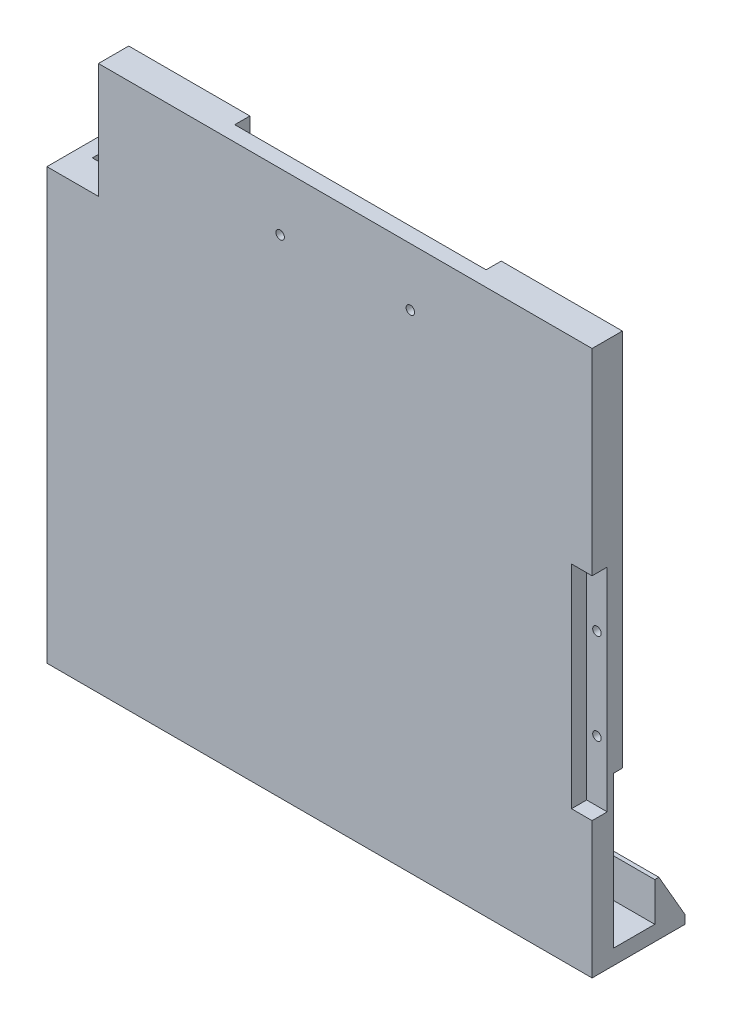
ISO-10303-21;
HEADER;
FILE_DESCRIPTION(('STEP AP214'),'2;1');
FILE_NAME('part.step','',(''),(''),'','','');
FILE_SCHEMA(('AUTOMOTIVE_DESIGN { 1 0 10303 214 1 1 1 1 }'));
ENDSEC;
DATA;
#1=APPLICATION_CONTEXT('core data for automotive mechanical design processes');
#2=APPLICATION_PROTOCOL_DEFINITION('international standard','automotive_design',2000,#1);
#3=PRODUCT_CONTEXT('',#1,'mechanical');
#4=PRODUCT('Part','Part','',(#3));
#5=PRODUCT_RELATED_PRODUCT_CATEGORY('part','',(#4));
#6=PRODUCT_DEFINITION_FORMATION('','',#4);
#7=PRODUCT_DEFINITION_CONTEXT('part definition',#1,'design');
#8=PRODUCT_DEFINITION('design','',#6,#7);
#9=PRODUCT_DEFINITION_SHAPE('','',#8);
#10=(LENGTH_UNIT() NAMED_UNIT(*) SI_UNIT(.MILLI.,.METRE.));
#11=(NAMED_UNIT(*) PLANE_ANGLE_UNIT() SI_UNIT($,.RADIAN.));
#12=(NAMED_UNIT(*) SI_UNIT($,.STERADIAN.) SOLID_ANGLE_UNIT());
#13=UNCERTAINTY_MEASURE_WITH_UNIT(LENGTH_MEASURE(1.E-05),#10,'distance_accuracy_value','');
#14=(GEOMETRIC_REPRESENTATION_CONTEXT(3) GLOBAL_UNCERTAINTY_ASSIGNED_CONTEXT((#13)) GLOBAL_UNIT_ASSIGNED_CONTEXT((#10,
#11,#12)) REPRESENTATION_CONTEXT('',''));
#15=CARTESIAN_POINT('',(0.,0.,0.));
#16=DIRECTION('',(0.,0.,1.));
#17=DIRECTION('',(1.,0.,0.));
#18=AXIS2_PLACEMENT_3D('',#15,#16,#17);
#19=CARTESIAN_POINT('',(0.,180.,30.7));
#20=DIRECTION('',(0.,-1.,0.));
#21=DIRECTION('',(0.,0.,-1.));
#22=AXIS2_PLACEMENT_3D('',#19,#20,#21);
#23=PLANE('',#22);
#24=DIRECTION('',(1.,0.,0.));
#25=VECTOR('',#24,1.);
#26=CARTESIAN_POINT('',(180.,180.,20.7));
#27=LINE('',#26,#25);
#28=CARTESIAN_POINT('',(140.,180.,20.7));
#29=VERTEX_POINT('',#28);
#30=CARTESIAN_POINT('',(180.,180.,20.7));
#31=VERTEX_POINT('',#30);
#32=EDGE_CURVE('E336',#29,#31,#27,.T.);
#33=ORIENTED_EDGE('',*,*,#32,.F.);
#34=DIRECTION('',(0.,0.,-1.));
#35=VECTOR('',#34,1.);
#36=CARTESIAN_POINT('',(140.,180.,25.7));
#37=LINE('',#36,#35);
#38=CARTESIAN_POINT('',(140.,180.,25.7));
#39=VERTEX_POINT('',#38);
#40=EDGE_CURVE('E286',#39,#29,#37,.T.);
#41=ORIENTED_EDGE('',*,*,#40,.F.);
#42=DIRECTION('',(1.,0.,0.));
#43=VECTOR('',#42,1.);
#44=CARTESIAN_POINT('',(140.,180.,25.7));
#45=LINE('',#44,#43);
#46=CARTESIAN_POINT('',(57.01,180.,25.7));
#47=VERTEX_POINT('',#46);
#48=EDGE_CURVE('E277',#47,#39,#45,.T.);
#49=ORIENTED_EDGE('',*,*,#48,.F.);
#50=DIRECTION('',(0.,0.,-1.));
#51=VECTOR('',#50,1.);
#52=CARTESIAN_POINT('',(57.01,180.,25.7));
#53=LINE('',#52,#51);
#54=CARTESIAN_POINT('',(57.01,180.,20.7));
#55=VERTEX_POINT('',#54);
#56=EDGE_CURVE('E289',#47,#55,#53,.T.);
#57=ORIENTED_EDGE('',*,*,#56,.T.);
#58=CARTESIAN_POINT('',(17.01,180.,20.7));
#59=VERTEX_POINT('',#58);
#60=EDGE_CURVE('E337',#59,#55,#27,.T.);
#61=ORIENTED_EDGE('',*,*,#60,.F.);
#62=DIRECTION('',(0.,0.,1.));
#63=VECTOR('',#62,1.);
#64=CARTESIAN_POINT('',(17.01,180.,0.));
#65=LINE('',#64,#63);
#66=CARTESIAN_POINT('',(17.01,180.,30.7));
#67=VERTEX_POINT('',#66);
#68=EDGE_CURVE('E299',#59,#67,#65,.T.);
#69=ORIENTED_EDGE('',*,*,#68,.T.);
#70=DIRECTION('',(-1.,0.,0.));
#71=VECTOR('',#70,1.);
#72=CARTESIAN_POINT('',(0.,180.,30.7));
#73=LINE('',#72,#71);
#74=CARTESIAN_POINT('',(180.,180.,30.7));
#75=VERTEX_POINT('',#74);
#76=EDGE_CURVE('E355',#75,#67,#73,.T.);
#77=ORIENTED_EDGE('',*,*,#76,.F.);
#78=DIRECTION('',(0.,0.,-1.));
#79=VECTOR('',#78,1.);
#80=CARTESIAN_POINT('',(180.,180.,30.7));
#81=LINE('',#80,#79);
#82=EDGE_CURVE('E358',#75,#31,#81,.T.);
#83=ORIENTED_EDGE('',*,*,#82,.T.);
#84=EDGE_LOOP('',(#33,#41,#49,#57,#61,#69,#77,#83));
#85=FACE_BOUND('',#84,.T.);
#86=ADVANCED_FACE('F41',(#85),#23,.F.);
#87=CARTESIAN_POINT('',(0.,0.,30.7));
#88=DIRECTION('',(1.,0.,0.));
#89=DIRECTION('',(0.,0.,-1.));
#90=AXIS2_PLACEMENT_3D('',#87,#88,#89);
#91=PLANE('',#90);
#92=DIRECTION('',(0.,-1.,0.));
#93=VECTOR('',#92,1.);
#94=CARTESIAN_POINT('',(0.,0.,30.7));
#95=LINE('',#94,#93);
#96=CARTESIAN_POINT('',(0.,142.,30.7));
#97=VERTEX_POINT('',#96);
#98=CARTESIAN_POINT('',(0.,0.,30.7));
#99=VERTEX_POINT('',#98);
#100=EDGE_CURVE('E346',#97,#99,#95,.T.);
#101=ORIENTED_EDGE('',*,*,#100,.F.);
#102=DIRECTION('',(0.,0.,1.));
#103=VECTOR('',#102,1.);
#104=CARTESIAN_POINT('',(0.,142.,0.));
#105=LINE('',#104,#103);
#106=CARTESIAN_POINT('',(0.,142.,0.));
#107=VERTEX_POINT('',#106);
#108=EDGE_CURVE('E288',#107,#97,#105,.T.);
#109=ORIENTED_EDGE('',*,*,#108,.F.);
#110=DIRECTION('',(0.,-1.,0.));
#111=VECTOR('',#110,1.);
#112=CARTESIAN_POINT('',(0.,0.,0.));
#113=LINE('',#112,#111);
#114=CARTESIAN_POINT('',(0.,0.,0.));
#115=VERTEX_POINT('',#114);
#116=EDGE_CURVE('E344',#107,#115,#113,.T.);
#117=ORIENTED_EDGE('',*,*,#116,.T.);
#118=DIRECTION('',(0.,0.,-1.));
#119=VECTOR('',#118,1.);
#120=CARTESIAN_POINT('',(0.,0.,30.7));
#121=LINE('',#120,#119);
#122=EDGE_CURVE('E368',#99,#115,#121,.T.);
#123=ORIENTED_EDGE('',*,*,#122,.F.);
#124=EDGE_LOOP('',(#101,#109,#117,#123));
#125=FACE_BOUND('',#124,.T.);
#126=ADVANCED_FACE('F421',(#125),#91,.F.);
#127=CARTESIAN_POINT('',(0.,0.,30.7));
#128=DIRECTION('',(0.,1.,0.));
#129=DIRECTION('',(0.,0.,1.));
#130=AXIS2_PLACEMENT_3D('',#127,#128,#129);
#131=PLANE('',#130);
#132=DIRECTION('',(1.,0.,0.));
#133=VECTOR('',#132,1.);
#134=CARTESIAN_POINT('',(0.,0.,0.));
#135=LINE('',#134,#133);
#136=CARTESIAN_POINT('',(180.,0.,0.));
#137=VERTEX_POINT('',#136);
#138=EDGE_CURVE('E360',#115,#137,#135,.T.);
#139=ORIENTED_EDGE('',*,*,#138,.T.);
#140=DIRECTION('',(0.,0.,-1.));
#141=VECTOR('',#140,1.);
#142=CARTESIAN_POINT('',(180.,0.,30.7));
#143=LINE('',#142,#141);
#144=CARTESIAN_POINT('',(180.,0.,30.7));
#145=VERTEX_POINT('',#144);
#146=EDGE_CURVE('E365',#145,#137,#143,.T.);
#147=ORIENTED_EDGE('',*,*,#146,.F.);
#148=DIRECTION('',(1.,0.,0.));
#149=VECTOR('',#148,1.);
#150=CARTESIAN_POINT('',(0.,0.,30.7));
#151=LINE('',#150,#149);
#152=EDGE_CURVE('E348',#99,#145,#151,.T.);
#153=ORIENTED_EDGE('',*,*,#152,.F.);
#154=ORIENTED_EDGE('',*,*,#122,.T.);
#155=EDGE_LOOP('',(#139,#147,#153,#154));
#156=FACE_BOUND('',#155,.T.);
#157=ADVANCED_FACE('F429',(#156),#131,.F.);
#158=CARTESIAN_POINT('',(180.,0.,30.7));
#159=DIRECTION('',(-1.,0.,0.));
#160=DIRECTION('',(0.,0.,1.));
#161=AXIS2_PLACEMENT_3D('',#158,#159,#160);
#162=PLANE('',#161);
#163=DIRECTION('',(0.,1.,0.));
#164=VECTOR('',#163,1.);
#165=CARTESIAN_POINT('',(180.,0.,0.));
#166=LINE('',#165,#164);
#167=CARTESIAN_POINT('',(180.,2.7899999999999,0.));
#168=VERTEX_POINT('',#167);
#169=EDGE_CURVE('E349',#137,#168,#166,.T.);
#170=ORIENTED_EDGE('',*,*,#169,.T.);
#171=DIRECTION('',(0.,0.86602540378444,0.499999999999997));
#172=VECTOR('',#171,1.);
#173=CARTESIAN_POINT('',(180.,17.79,8.66025403784437));
#174=LINE('',#173,#172);
#175=CARTESIAN_POINT('',(180.,17.79,8.66025403784437));
#176=VERTEX_POINT('',#175);
#177=EDGE_CURVE('E12',#168,#176,#174,.T.);
#178=ORIENTED_EDGE('',*,*,#177,.T.);
#179=DIRECTION('',(0.,0.,-1.));
#180=VECTOR('',#179,1.);
#181=CARTESIAN_POINT('',(180.,17.79,20.7));
#182=LINE('',#181,#180);
#183=CARTESIAN_POINT('',(180.,17.79,10.));
#184=VERTEX_POINT('',#183);
#185=EDGE_CURVE('E340',#184,#176,#182,.T.);
#186=ORIENTED_EDGE('',*,*,#185,.F.);
#187=DIRECTION('',(0.,1.,0.));
#188=VECTOR('',#187,1.);
#189=CARTESIAN_POINT('',(180.,-175.326809130834,10.));
#190=LINE('',#189,#188);
#191=CARTESIAN_POINT('',(180.,5.,10.));
#192=VERTEX_POINT('',#191);
#193=EDGE_CURVE('E320',#192,#184,#190,.T.);
#194=ORIENTED_EDGE('',*,*,#193,.F.);
#195=DIRECTION('',(0.,0.,1.));
#196=VECTOR('',#195,1.);
#197=CARTESIAN_POINT('',(180.,5.,20.7));
#198=LINE('',#197,#196);
#199=CARTESIAN_POINT('',(180.,5.,23.7));
#200=VERTEX_POINT('',#199);
#201=EDGE_CURVE('E323',#192,#200,#198,.T.);
#202=ORIENTED_EDGE('',*,*,#201,.T.);
#203=DIRECTION('',(0.,-1.,0.));
#204=VECTOR('',#203,1.);
#205=CARTESIAN_POINT('',(180.,5.,23.7));
#206=LINE('',#205,#204);
#207=CARTESIAN_POINT('',(180.,55.,23.7));
#208=VERTEX_POINT('',#207);
#209=EDGE_CURVE('E223',#208,#200,#206,.T.);
#210=ORIENTED_EDGE('',*,*,#209,.F.);
#211=DIRECTION('',(0.,0.,-1.));
#212=VECTOR('',#211,1.);
#213=CARTESIAN_POINT('',(180.,55.,23.7));
#214=LINE('',#213,#212);
#215=CARTESIAN_POINT('',(180.,55.,20.7));
#216=VERTEX_POINT('',#215);
#217=EDGE_CURVE('E213',#208,#216,#214,.T.);
#218=ORIENTED_EDGE('',*,*,#217,.T.);
#219=DIRECTION('',(0.,-1.,0.));
#220=VECTOR('',#219,1.);
#221=CARTESIAN_POINT('',(180.,17.79,20.7));
#222=LINE('',#221,#220);
#223=EDGE_CURVE('E333',#31,#216,#222,.T.);
#224=ORIENTED_EDGE('',*,*,#223,.F.);
#225=ORIENTED_EDGE('',*,*,#82,.F.);
#226=DIRECTION('',(0.,1.,0.));
#227=VECTOR('',#226,1.);
#228=CARTESIAN_POINT('',(180.,0.,30.7));
#229=LINE('',#228,#227);
#230=CARTESIAN_POINT('',(180.,115.,30.7));
#231=VERTEX_POINT('',#230);
#232=EDGE_CURVE('E351',#231,#75,#229,.T.);
#233=ORIENTED_EDGE('',*,*,#232,.F.);
#234=DIRECTION('',(0.,0.,1.));
#235=VECTOR('',#234,1.);
#236=CARTESIAN_POINT('',(180.,115.,25.7));
#237=LINE('',#236,#235);
#238=CARTESIAN_POINT('',(180.,115.,25.7));
#239=VERTEX_POINT('',#238);
#240=EDGE_CURVE('E260',#239,#231,#237,.T.);
#241=ORIENTED_EDGE('',*,*,#240,.F.);
#242=DIRECTION('',(0.,1.,0.));
#243=VECTOR('',#242,1.);
#244=CARTESIAN_POINT('',(180.,115.,25.7));
#245=LINE('',#244,#243);
#246=CARTESIAN_POINT('',(180.,45.,25.7));
#247=VERTEX_POINT('',#246);
#248=EDGE_CURVE('E246',#247,#239,#245,.T.);
#249=ORIENTED_EDGE('',*,*,#248,.F.);
#250=DIRECTION('',(0.,0.,1.));
#251=VECTOR('',#250,1.);
#252=CARTESIAN_POINT('',(180.,45.,25.7));
#253=LINE('',#252,#251);
#254=CARTESIAN_POINT('',(180.,45.,30.7));
#255=VERTEX_POINT('',#254);
#256=EDGE_CURVE('E262',#247,#255,#253,.T.);
#257=ORIENTED_EDGE('',*,*,#256,.T.);
#258=EDGE_CURVE('E352',#145,#255,#229,.T.);
#259=ORIENTED_EDGE('',*,*,#258,.F.);
#260=ORIENTED_EDGE('',*,*,#146,.T.);
#261=EDGE_LOOP('',(#170,#178,#186,#194,#202,#210,#218,#224,#225,#233,#241,#249,#257,#259,#260));
#262=FACE_BOUND('',#261,.T.);
#263=ADVANCED_FACE('F437',(#262),#162,.F.);
#264=CARTESIAN_POINT('',(0.,0.,30.7));
#265=DIRECTION('',(0.,0.,-1.));
#266=DIRECTION('',(-1.,0.,0.));
#267=AXIS2_PLACEMENT_3D('',#264,#265,#266);
#268=PLANE('',#267);
#269=CARTESIAN_POINT('',(120.,161.,30.7));
#270=DIRECTION('',(0.,0.,1.));
#271=DIRECTION('',(1.,0.,0.));
#272=AXIS2_PLACEMENT_3D('',#269,#270,#271);
#273=CIRCLE('',#272,1.40000000000001);
#274=CARTESIAN_POINT('',(121.4,161.,30.7));
#275=VERTEX_POINT('',#274);
#276=EDGE_CURVE('E391',#275,#275,#273,.T.);
#277=ORIENTED_EDGE('',*,*,#276,.F.);
#278=EDGE_LOOP('',(#277));
#279=FACE_BOUND('',#278,.T.);
#280=CARTESIAN_POINT('',(77.01,161.,30.7));
#281=DIRECTION('',(0.,0.,1.));
#282=DIRECTION('',(1.,0.,0.));
#283=AXIS2_PLACEMENT_3D('',#280,#281,#282);
#284=CIRCLE('',#283,1.40000000000002);
#285=CARTESIAN_POINT('',(78.41,161.,30.7));
#286=VERTEX_POINT('',#285);
#287=EDGE_CURVE('E512',#286,#286,#284,.T.);
#288=ORIENTED_EDGE('',*,*,#287,.F.);
#289=EDGE_LOOP('',(#288));
#290=FACE_BOUND('',#289,.T.);
#291=DIRECTION('',(0.,-1.,0.));
#292=VECTOR('',#291,1.);
#293=CARTESIAN_POINT('',(173.2,115.,30.7));
#294=LINE('',#293,#292);
#295=CARTESIAN_POINT('',(173.2,115.,30.7));
#296=VERTEX_POINT('',#295);
#297=CARTESIAN_POINT('',(173.2,45.,30.7));
#298=VERTEX_POINT('',#297);
#299=EDGE_CURVE('E237',#296,#298,#294,.T.);
#300=ORIENTED_EDGE('',*,*,#299,.F.);
#301=DIRECTION('',(-1.,0.,0.));
#302=VECTOR('',#301,1.);
#303=CARTESIAN_POINT('',(173.2,115.,30.7));
#304=LINE('',#303,#302);
#305=EDGE_CURVE('E243',#231,#296,#304,.T.);
#306=ORIENTED_EDGE('',*,*,#305,.F.);
#307=ORIENTED_EDGE('',*,*,#232,.T.);
#308=ORIENTED_EDGE('',*,*,#76,.T.);
#309=DIRECTION('',(0.,-1.,0.));
#310=VECTOR('',#309,1.);
#311=CARTESIAN_POINT('',(17.01,180.,30.7));
#312=LINE('',#311,#310);
#313=CARTESIAN_POINT('',(17.01,142.,30.7));
#314=VERTEX_POINT('',#313);
#315=EDGE_CURVE('E296',#67,#314,#312,.T.);
#316=ORIENTED_EDGE('',*,*,#315,.T.);
#317=DIRECTION('',(-1.,0.,0.));
#318=VECTOR('',#317,1.);
#319=CARTESIAN_POINT('',(65.8617144018508,142.,30.7));
#320=LINE('',#319,#318);
#321=EDGE_CURVE('E300',#314,#97,#320,.T.);
#322=ORIENTED_EDGE('',*,*,#321,.T.);
#323=ORIENTED_EDGE('',*,*,#100,.T.);
#324=ORIENTED_EDGE('',*,*,#152,.T.);
#325=ORIENTED_EDGE('',*,*,#258,.T.);
#326=DIRECTION('',(1.,0.,0.));
#327=VECTOR('',#326,1.);
#328=CARTESIAN_POINT('',(173.2,45.,30.7));
#329=LINE('',#328,#327);
#330=EDGE_CURVE('E253',#298,#255,#329,.T.);
#331=ORIENTED_EDGE('',*,*,#330,.F.);
#332=EDGE_LOOP('',(#300,#306,#307,#308,#316,#322,#323,#324,#325,#331));
#333=FACE_BOUND('',#332,.T.);
#334=ADVANCED_FACE('F440',(#279,#290,#333),#268,.F.);
#335=CARTESIAN_POINT('',(0.,0.,0.));
#336=DIRECTION('',(0.,0.,-1.));
#337=DIRECTION('',(-1.,0.,0.));
#338=AXIS2_PLACEMENT_3D('',#335,#336,#337);
#339=PLANE('',#338);
#340=DIRECTION('',(-1.,0.,0.));
#341=VECTOR('',#340,1.);
#342=CARTESIAN_POINT('',(65.8617144018508,142.,0.));
#343=LINE('',#342,#341);
#344=CARTESIAN_POINT('',(2.0099999999999,142.,0.));
#345=VERTEX_POINT('',#344);
#346=EDGE_CURVE('E305',#345,#107,#343,.T.);
#347=ORIENTED_EDGE('',*,*,#346,.F.);
#348=DIRECTION('',(0.,-1.,0.));
#349=VECTOR('',#348,1.);
#350=CARTESIAN_POINT('',(2.0099999999999,17.79,0.));
#351=LINE('',#350,#349);
#352=CARTESIAN_POINT('',(2.0099999999999,2.7899999999999,0.));
#353=VERTEX_POINT('',#352);
#354=EDGE_CURVE('E64',#345,#353,#351,.T.);
#355=ORIENTED_EDGE('',*,*,#354,.T.);
#356=DIRECTION('',(1.,0.,0.));
#357=VECTOR('',#356,1.);
#358=CARTESIAN_POINT('',(180.,2.7899999999999,0.));
#359=LINE('',#358,#357);
#360=EDGE_CURVE('E381',#353,#168,#359,.T.);
#361=ORIENTED_EDGE('',*,*,#360,.T.);
#362=ORIENTED_EDGE('',*,*,#169,.F.);
#363=ORIENTED_EDGE('',*,*,#138,.F.);
#364=ORIENTED_EDGE('',*,*,#116,.F.);
#365=EDGE_LOOP('',(#347,#355,#361,#362,#363,#364));
#366=FACE_BOUND('',#365,.T.);
#367=ADVANCED_FACE('F435',(#366),#339,.T.);
#368=CARTESIAN_POINT('',(17.01,17.79,20.7));
#369=DIRECTION('',(-1.,0.,0.));
#370=DIRECTION('',(0.,0.,1.));
#371=AXIS2_PLACEMENT_3D('',#368,#369,#370);
#372=PLANE('',#371);
#373=DIRECTION('',(0.,0.,-1.));
#374=VECTOR('',#373,1.);
#375=CARTESIAN_POINT('',(17.01,17.79,20.7));
#376=LINE('',#375,#374);
#377=CARTESIAN_POINT('',(17.01,17.79,10.));
#378=VERTEX_POINT('',#377);
#379=CARTESIAN_POINT('',(17.01,17.79,8.66025403784437));
#380=VERTEX_POINT('',#379);
#381=EDGE_CURVE('E341',#378,#380,#376,.T.);
#382=ORIENTED_EDGE('',*,*,#381,.T.);
#383=DIRECTION('',(0.,1.,0.));
#384=VECTOR('',#383,1.);
#385=CARTESIAN_POINT('',(17.01,142.,8.66025403784437));
#386=LINE('',#385,#384);
#387=CARTESIAN_POINT('',(17.01,142.,8.66025403784437));
#388=VERTEX_POINT('',#387);
#389=EDGE_CURVE('E376',#380,#388,#386,.T.);
#390=ORIENTED_EDGE('',*,*,#389,.T.);
#391=DIRECTION('',(0.,0.,-1.));
#392=VECTOR('',#391,1.);
#393=CARTESIAN_POINT('',(17.01,142.,0.));
#394=LINE('',#393,#392);
#395=CARTESIAN_POINT('',(17.01,142.,10.));
#396=VERTEX_POINT('',#395);
#397=EDGE_CURVE('E303',#396,#388,#394,.T.);
#398=ORIENTED_EDGE('',*,*,#397,.F.);
#399=DIRECTION('',(0.,-1.,0.));
#400=VECTOR('',#399,1.);
#401=CARTESIAN_POINT('',(17.01,17.79,10.));
#402=LINE('',#401,#400);
#403=EDGE_CURVE('E331',#396,#378,#402,.T.);
#404=ORIENTED_EDGE('',*,*,#403,.T.);
#405=EDGE_LOOP('',(#382,#390,#398,#404));
#406=FACE_BOUND('',#405,.T.);
#407=ADVANCED_FACE('F491',(#406),#372,.F.);
#408=CARTESIAN_POINT('',(180.,17.79,20.7));
#409=DIRECTION('',(0.,-1.,0.));
#410=DIRECTION('',(0.,0.,-1.));
#411=AXIS2_PLACEMENT_3D('',#408,#409,#410);
#412=PLANE('',#411);
#413=ORIENTED_EDGE('',*,*,#185,.T.);
#414=DIRECTION('',(-1.,0.,0.));
#415=VECTOR('',#414,1.);
#416=CARTESIAN_POINT('',(17.01,17.79,8.66025403784437));
#417=LINE('',#416,#415);
#418=EDGE_CURVE('E50',#176,#380,#417,.T.);
#419=ORIENTED_EDGE('',*,*,#418,.T.);
#420=ORIENTED_EDGE('',*,*,#381,.F.);
#421=DIRECTION('',(1.,0.,0.));
#422=VECTOR('',#421,1.);
#423=CARTESIAN_POINT('',(180.,17.79,10.));
#424=LINE('',#423,#422);
#425=EDGE_CURVE('E371',#378,#184,#424,.T.);
#426=ORIENTED_EDGE('',*,*,#425,.T.);
#427=EDGE_LOOP('',(#413,#419,#420,#426));
#428=FACE_BOUND('',#427,.T.);
#429=ADVANCED_FACE('F489',(#428),#412,.F.);
#430=CARTESIAN_POINT('',(0.,0.,20.7));
#431=DIRECTION('',(0.,0.,1.));
#432=DIRECTION('',(1.,0.,0.));
#433=AXIS2_PLACEMENT_3D('',#430,#431,#432);
#434=PLANE('',#433);
#435=CARTESIAN_POINT('',(176.6,65.,20.7));
#436=DIRECTION('',(0.,0.,1.));
#437=DIRECTION('',(1.,0.,0.));
#438=AXIS2_PLACEMENT_3D('',#435,#436,#437);
#439=CIRCLE('',#438,1.40000000000003);
#440=CARTESIAN_POINT('',(178.,65.,20.7));
#441=VERTEX_POINT('',#440);
#442=EDGE_CURVE('E232',#441,#441,#439,.T.);
#443=ORIENTED_EDGE('',*,*,#442,.T.);
#444=EDGE_LOOP('',(#443));
#445=FACE_BOUND('',#444,.T.);
#446=CARTESIAN_POINT('',(176.6,95.,20.7));
#447=DIRECTION('',(0.,0.,1.));
#448=DIRECTION('',(1.,0.,0.));
#449=AXIS2_PLACEMENT_3D('',#446,#447,#448);
#450=CIRCLE('',#449,1.4);
#451=CARTESIAN_POINT('',(178.,95.,20.7));
#452=VERTEX_POINT('',#451);
#453=EDGE_CURVE('E390',#452,#452,#450,.T.);
#454=ORIENTED_EDGE('',*,*,#453,.T.);
#455=EDGE_LOOP('',(#454));
#456=FACE_BOUND('',#455,.T.);
#457=ORIENTED_EDGE('',*,*,#223,.T.);
#458=DIRECTION('',(1.,0.,0.));
#459=VECTOR('',#458,1.);
#460=CARTESIAN_POINT('',(5.,55.,20.7));
#461=LINE('',#460,#459);
#462=CARTESIAN_POINT('',(5.,55.,20.7));
#463=VERTEX_POINT('',#462);
#464=EDGE_CURVE('E227',#463,#216,#461,.T.);
#465=ORIENTED_EDGE('',*,*,#464,.F.);
#466=DIRECTION('',(0.,1.,0.));
#467=VECTOR('',#466,1.);
#468=CARTESIAN_POINT('',(5.,-175.326809130834,20.7));
#469=LINE('',#468,#467);
#470=CARTESIAN_POINT('',(5.,142.,20.7));
#471=VERTEX_POINT('',#470);
#472=EDGE_CURVE('E210',#463,#471,#469,.T.);
#473=ORIENTED_EDGE('',*,*,#472,.T.);
#474=DIRECTION('',(1.,0.,0.));
#475=VECTOR('',#474,1.);
#476=CARTESIAN_POINT('',(0.,142.,20.7));
#477=LINE('',#476,#475);
#478=CARTESIAN_POINT('',(17.01,142.,20.7));
#479=VERTEX_POINT('',#478);
#480=EDGE_CURVE('E315',#471,#479,#477,.T.);
#481=ORIENTED_EDGE('',*,*,#480,.T.);
#482=DIRECTION('',(0.,-1.,0.));
#483=VECTOR('',#482,1.);
#484=CARTESIAN_POINT('',(17.01,0.,20.7));
#485=LINE('',#484,#483);
#486=EDGE_CURVE('E318',#59,#479,#485,.T.);
#487=ORIENTED_EDGE('',*,*,#486,.F.);
#488=ORIENTED_EDGE('',*,*,#60,.T.);
#489=DIRECTION('',(0.,1.,0.));
#490=VECTOR('',#489,1.);
#491=CARTESIAN_POINT('',(57.01,180.,20.7));
#492=LINE('',#491,#490);
#493=CARTESIAN_POINT('',(57.01,142.,20.7));
#494=VERTEX_POINT('',#493);
#495=EDGE_CURVE('E271',#494,#55,#492,.T.);
#496=ORIENTED_EDGE('',*,*,#495,.F.);
#497=DIRECTION('',(-1.,0.,0.));
#498=VECTOR('',#497,1.);
#499=CARTESIAN_POINT('',(140.,142.,20.7));
#500=LINE('',#499,#498);
#501=CARTESIAN_POINT('',(140.,142.,20.7));
#502=VERTEX_POINT('',#501);
#503=EDGE_CURVE('E282',#502,#494,#500,.T.);
#504=ORIENTED_EDGE('',*,*,#503,.F.);
#505=DIRECTION('',(0.,-1.,0.));
#506=VECTOR('',#505,1.);
#507=CARTESIAN_POINT('',(140.,180.,20.7));
#508=LINE('',#507,#506);
#509=EDGE_CURVE('E259',#29,#502,#508,.T.);
#510=ORIENTED_EDGE('',*,*,#509,.F.);
#511=ORIENTED_EDGE('',*,*,#32,.T.);
#512=EDGE_LOOP('',(#457,#465,#473,#481,#487,#488,#496,#504,#510,#511));
#513=FACE_BOUND('',#512,.T.);
#514=ADVANCED_FACE('F402',(#445,#456,#513),#434,.F.);
#515=CARTESIAN_POINT('',(180.,-175.326809130834,10.));
#516=DIRECTION('',(0.,0.,-1.));
#517=DIRECTION('',(-1.,0.,0.));
#518=AXIS2_PLACEMENT_3D('',#515,#516,#517);
#519=PLANE('',#518);
#520=ORIENTED_EDGE('',*,*,#403,.F.);
#521=DIRECTION('',(-1.,0.,0.));
#522=VECTOR('',#521,1.);
#523=CARTESIAN_POINT('',(180.,142.,10.));
#524=LINE('',#523,#522);
#525=CARTESIAN_POINT('',(5.,142.,10.));
#526=VERTEX_POINT('',#525);
#527=EDGE_CURVE('E312',#396,#526,#524,.T.);
#528=ORIENTED_EDGE('',*,*,#527,.T.);
#529=DIRECTION('',(0.,1.,0.));
#530=VECTOR('',#529,1.);
#531=CARTESIAN_POINT('',(5.,-175.326809130834,10.));
#532=LINE('',#531,#530);
#533=CARTESIAN_POINT('',(5.,4.99999999999995,10.));
#534=VERTEX_POINT('',#533);
#535=EDGE_CURVE('E327',#534,#526,#532,.T.);
#536=ORIENTED_EDGE('',*,*,#535,.F.);
#537=DIRECTION('',(1.,0.,0.));
#538=VECTOR('',#537,1.);
#539=CARTESIAN_POINT('',(180.,5.,10.));
#540=LINE('',#539,#538);
#541=EDGE_CURVE('E325',#534,#192,#540,.T.);
#542=ORIENTED_EDGE('',*,*,#541,.T.);
#543=ORIENTED_EDGE('',*,*,#193,.T.);
#544=ORIENTED_EDGE('',*,*,#425,.F.);
#545=EDGE_LOOP('',(#520,#528,#536,#542,#543,#544));
#546=FACE_BOUND('',#545,.T.);
#547=ADVANCED_FACE('F481',(#546),#519,.F.);
#548=CARTESIAN_POINT('',(5.,-175.326809130834,20.7));
#549=DIRECTION('',(-1.,0.,0.));
#550=DIRECTION('',(0.,0.,1.));
#551=AXIS2_PLACEMENT_3D('',#548,#549,#550);
#552=PLANE('',#551);
#553=ORIENTED_EDGE('',*,*,#535,.T.);
#554=DIRECTION('',(0.,0.,1.));
#555=VECTOR('',#554,1.);
#556=CARTESIAN_POINT('',(5.,142.,20.7));
#557=LINE('',#556,#555);
#558=EDGE_CURVE('E374',#526,#471,#557,.T.);
#559=ORIENTED_EDGE('',*,*,#558,.T.);
#560=ORIENTED_EDGE('',*,*,#472,.F.);
#561=DIRECTION('',(0.,0.,-1.));
#562=VECTOR('',#561,1.);
#563=CARTESIAN_POINT('',(5.,55.,23.7));
#564=LINE('',#563,#562);
#565=CARTESIAN_POINT('',(5.,55.,23.7));
#566=VERTEX_POINT('',#565);
#567=EDGE_CURVE('E202',#566,#463,#564,.T.);
#568=ORIENTED_EDGE('',*,*,#567,.F.);
#569=DIRECTION('',(0.,1.,0.));
#570=VECTOR('',#569,1.);
#571=CARTESIAN_POINT('',(5.,5.,23.7));
#572=LINE('',#571,#570);
#573=CARTESIAN_POINT('',(5.,5.,23.7));
#574=VERTEX_POINT('',#573);
#575=EDGE_CURVE('E207',#574,#566,#572,.T.);
#576=ORIENTED_EDGE('',*,*,#575,.F.);
#577=DIRECTION('',(0.,0.,-1.));
#578=VECTOR('',#577,1.);
#579=CARTESIAN_POINT('',(5.,5.,20.7));
#580=LINE('',#579,#578);
#581=EDGE_CURVE('E321',#574,#534,#580,.T.);
#582=ORIENTED_EDGE('',*,*,#581,.T.);
#583=EDGE_LOOP('',(#553,#559,#560,#568,#576,#582));
#584=FACE_BOUND('',#583,.T.);
#585=ADVANCED_FACE('F205',(#584),#552,.F.);
#586=CARTESIAN_POINT('',(0.,5.,30.7));
#587=DIRECTION('',(0.,1.,0.));
#588=DIRECTION('',(0.,0.,1.));
#589=AXIS2_PLACEMENT_3D('',#586,#587,#588);
#590=PLANE('',#589);
#591=ORIENTED_EDGE('',*,*,#201,.F.);
#592=ORIENTED_EDGE('',*,*,#541,.F.);
#593=ORIENTED_EDGE('',*,*,#581,.F.);
#594=DIRECTION('',(-1.,0.,0.));
#595=VECTOR('',#594,1.);
#596=CARTESIAN_POINT('',(5.,5.,23.7));
#597=LINE('',#596,#595);
#598=EDGE_CURVE('E214',#200,#574,#597,.T.);
#599=ORIENTED_EDGE('',*,*,#598,.F.);
#600=EDGE_LOOP('',(#591,#592,#593,#599));
#601=FACE_BOUND('',#600,.T.);
#602=ADVANCED_FACE('F484',(#601),#590,.T.);
#603=CARTESIAN_POINT('',(17.01,17.79,20.7));
#604=DIRECTION('',(-1.,0.,0.));
#605=DIRECTION('',(0.,0.,1.));
#606=AXIS2_PLACEMENT_3D('',#603,#604,#605);
#607=PLANE('',#606);
#608=ORIENTED_EDGE('',*,*,#486,.T.);
#609=EDGE_CURVE('E309',#314,#479,#394,.T.);
#610=ORIENTED_EDGE('',*,*,#609,.F.);
#611=ORIENTED_EDGE('',*,*,#315,.F.);
#612=ORIENTED_EDGE('',*,*,#68,.F.);
#613=EDGE_LOOP('',(#608,#610,#611,#612));
#614=FACE_BOUND('',#613,.T.);
#615=ADVANCED_FACE('F469',(#614),#607,.T.);
#616=CARTESIAN_POINT('',(65.8617144018508,142.,0.));
#617=DIRECTION('',(0.,-1.,0.));
#618=DIRECTION('',(0.,0.,-1.));
#619=AXIS2_PLACEMENT_3D('',#616,#617,#618);
#620=PLANE('',#619);
#621=ORIENTED_EDGE('',*,*,#397,.T.);
#622=DIRECTION('',(-0.86602540378444,0.,-0.499999999999997));
#623=VECTOR('',#622,1.);
#624=CARTESIAN_POINT('',(17.01,142.,8.66025403784437));
#625=LINE('',#624,#623);
#626=EDGE_CURVE('E379',#388,#345,#625,.T.);
#627=ORIENTED_EDGE('',*,*,#626,.T.);
#628=ORIENTED_EDGE('',*,*,#346,.T.);
#629=ORIENTED_EDGE('',*,*,#108,.T.);
#630=ORIENTED_EDGE('',*,*,#321,.F.);
#631=ORIENTED_EDGE('',*,*,#609,.T.);
#632=ORIENTED_EDGE('',*,*,#480,.F.);
#633=ORIENTED_EDGE('',*,*,#558,.F.);
#634=ORIENTED_EDGE('',*,*,#527,.F.);
#635=EDGE_LOOP('',(#621,#627,#628,#629,#630,#631,#632,#633,#634));
#636=FACE_BOUND('',#635,.T.);
#637=ADVANCED_FACE('F463',(#636),#620,.F.);
#638=CARTESIAN_POINT('',(140.,180.,25.7));
#639=DIRECTION('',(1.,0.,0.));
#640=DIRECTION('',(0.,1.,0.));
#641=AXIS2_PLACEMENT_3D('',#638,#639,#640);
#642=PLANE('',#641);
#643=ORIENTED_EDGE('',*,*,#509,.T.);
#644=DIRECTION('',(0.,0.,-1.));
#645=VECTOR('',#644,1.);
#646=CARTESIAN_POINT('',(140.,142.,25.7));
#647=LINE('',#646,#645);
#648=CARTESIAN_POINT('',(140.,142.,25.7));
#649=VERTEX_POINT('',#648);
#650=EDGE_CURVE('E280',#649,#502,#647,.T.);
#651=ORIENTED_EDGE('',*,*,#650,.F.);
#652=DIRECTION('',(0.,-1.,0.));
#653=VECTOR('',#652,1.);
#654=CARTESIAN_POINT('',(140.,180.,25.7));
#655=LINE('',#654,#653);
#656=EDGE_CURVE('E267',#39,#649,#655,.T.);
#657=ORIENTED_EDGE('',*,*,#656,.F.);
#658=ORIENTED_EDGE('',*,*,#40,.T.);
#659=EDGE_LOOP('',(#643,#651,#657,#658));
#660=FACE_BOUND('',#659,.T.);
#661=ADVANCED_FACE('F532',(#660),#642,.F.);
#662=CARTESIAN_POINT('',(57.01,180.,25.7));
#663=DIRECTION('',(-1.,0.,0.));
#664=DIRECTION('',(0.,-1.,0.));
#665=AXIS2_PLACEMENT_3D('',#662,#663,#664);
#666=PLANE('',#665);
#667=ORIENTED_EDGE('',*,*,#495,.T.);
#668=ORIENTED_EDGE('',*,*,#56,.F.);
#669=DIRECTION('',(0.,1.,0.));
#670=VECTOR('',#669,1.);
#671=CARTESIAN_POINT('',(57.01,180.,25.7));
#672=LINE('',#671,#670);
#673=CARTESIAN_POINT('',(57.01,142.,25.7));
#674=VERTEX_POINT('',#673);
#675=EDGE_CURVE('E274',#674,#47,#672,.T.);
#676=ORIENTED_EDGE('',*,*,#675,.F.);
#677=DIRECTION('',(0.,0.,-1.));
#678=VECTOR('',#677,1.);
#679=CARTESIAN_POINT('',(57.01,142.,25.7));
#680=LINE('',#679,#678);
#681=EDGE_CURVE('E292',#674,#494,#680,.T.);
#682=ORIENTED_EDGE('',*,*,#681,.T.);
#683=EDGE_LOOP('',(#667,#668,#676,#682));
#684=FACE_BOUND('',#683,.T.);
#685=ADVANCED_FACE('F537',(#684),#666,.F.);
#686=CARTESIAN_POINT('',(140.,142.,25.7));
#687=DIRECTION('',(0.,-1.,0.));
#688=DIRECTION('',(0.,0.,-1.));
#689=AXIS2_PLACEMENT_3D('',#686,#687,#688);
#690=PLANE('',#689);
#691=ORIENTED_EDGE('',*,*,#503,.T.);
#692=ORIENTED_EDGE('',*,*,#681,.F.);
#693=DIRECTION('',(-1.,0.,0.));
#694=VECTOR('',#693,1.);
#695=CARTESIAN_POINT('',(140.,142.,25.7));
#696=LINE('',#695,#694);
#697=EDGE_CURVE('E270',#649,#674,#696,.T.);
#698=ORIENTED_EDGE('',*,*,#697,.F.);
#699=ORIENTED_EDGE('',*,*,#650,.T.);
#700=EDGE_LOOP('',(#691,#692,#698,#699));
#701=FACE_BOUND('',#700,.T.);
#702=ADVANCED_FACE('F539',(#701),#690,.F.);
#703=CARTESIAN_POINT('',(0.,0.,25.7));
#704=DIRECTION('',(0.,0.,-1.));
#705=DIRECTION('',(-1.,0.,0.));
#706=AXIS2_PLACEMENT_3D('',#703,#704,#705);
#707=PLANE('',#706);
#708=CARTESIAN_POINT('',(120.,161.,25.7));
#709=DIRECTION('',(0.,0.,-1.));
#710=DIRECTION('',(-1.,0.,0.));
#711=AXIS2_PLACEMENT_3D('',#708,#709,#710);
#712=CIRCLE('',#711,1.40000000000001);
#713=CARTESIAN_POINT('',(118.6,161.,25.7));
#714=VERTEX_POINT('',#713);
#715=EDGE_CURVE('E45',#714,#714,#712,.T.);
#716=ORIENTED_EDGE('',*,*,#715,.F.);
#717=EDGE_LOOP('',(#716));
#718=FACE_BOUND('',#717,.T.);
#719=CARTESIAN_POINT('',(77.01,161.,25.7));
#720=DIRECTION('',(0.,0.,-1.));
#721=DIRECTION('',(-1.,0.,0.));
#722=AXIS2_PLACEMENT_3D('',#719,#720,#721);
#723=CIRCLE('',#722,1.40000000000002);
#724=CARTESIAN_POINT('',(75.61,161.,25.7));
#725=VERTEX_POINT('',#724);
#726=EDGE_CURVE('E394',#725,#725,#723,.T.);
#727=ORIENTED_EDGE('',*,*,#726,.F.);
#728=EDGE_LOOP('',(#727));
#729=FACE_BOUND('',#728,.T.);
#730=ORIENTED_EDGE('',*,*,#656,.T.);
#731=ORIENTED_EDGE('',*,*,#697,.T.);
#732=ORIENTED_EDGE('',*,*,#675,.T.);
#733=ORIENTED_EDGE('',*,*,#48,.T.);
#734=EDGE_LOOP('',(#730,#731,#732,#733));
#735=FACE_BOUND('',#734,.T.);
#736=ADVANCED_FACE('F542',(#718,#729,#735),#707,.T.);
#737=CARTESIAN_POINT('',(173.2,115.,25.7));
#738=DIRECTION('',(-1.,0.,0.));
#739=DIRECTION('',(0.,0.,1.));
#740=AXIS2_PLACEMENT_3D('',#737,#738,#739);
#741=PLANE('',#740);
#742=ORIENTED_EDGE('',*,*,#299,.T.);
#743=DIRECTION('',(0.,0.,1.));
#744=VECTOR('',#743,1.);
#745=CARTESIAN_POINT('',(173.2,45.,25.7));
#746=LINE('',#745,#744);
#747=CARTESIAN_POINT('',(173.2,45.,25.7));
#748=VERTEX_POINT('',#747);
#749=EDGE_CURVE('E251',#748,#298,#746,.T.);
#750=ORIENTED_EDGE('',*,*,#749,.F.);
#751=DIRECTION('',(0.,-1.,0.));
#752=VECTOR('',#751,1.);
#753=CARTESIAN_POINT('',(173.2,115.,25.7));
#754=LINE('',#753,#752);
#755=CARTESIAN_POINT('',(173.2,115.,25.7));
#756=VERTEX_POINT('',#755);
#757=EDGE_CURVE('E239',#756,#748,#754,.T.);
#758=ORIENTED_EDGE('',*,*,#757,.F.);
#759=DIRECTION('',(0.,0.,1.));
#760=VECTOR('',#759,1.);
#761=CARTESIAN_POINT('',(173.2,115.,25.7));
#762=LINE('',#761,#760);
#763=EDGE_CURVE('E257',#756,#296,#762,.T.);
#764=ORIENTED_EDGE('',*,*,#763,.T.);
#765=EDGE_LOOP('',(#742,#750,#758,#764));
#766=FACE_BOUND('',#765,.T.);
#767=ADVANCED_FACE('F548',(#766),#741,.F.);
#768=CARTESIAN_POINT('',(173.2,115.,25.7));
#769=DIRECTION('',(0.,1.,0.));
#770=DIRECTION('',(0.,0.,1.));
#771=AXIS2_PLACEMENT_3D('',#768,#769,#770);
#772=PLANE('',#771);
#773=ORIENTED_EDGE('',*,*,#305,.T.);
#774=ORIENTED_EDGE('',*,*,#763,.F.);
#775=DIRECTION('',(-1.,0.,0.));
#776=VECTOR('',#775,1.);
#777=CARTESIAN_POINT('',(173.2,115.,25.7));
#778=LINE('',#777,#776);
#779=EDGE_CURVE('E248',#239,#756,#778,.T.);
#780=ORIENTED_EDGE('',*,*,#779,.F.);
#781=ORIENTED_EDGE('',*,*,#240,.T.);
#782=EDGE_LOOP('',(#773,#774,#780,#781));
#783=FACE_BOUND('',#782,.T.);
#784=ADVANCED_FACE('F552',(#783),#772,.F.);
#785=CARTESIAN_POINT('',(173.2,45.,25.7));
#786=DIRECTION('',(0.,-1.,0.));
#787=DIRECTION('',(0.,0.,-1.));
#788=AXIS2_PLACEMENT_3D('',#785,#786,#787);
#789=PLANE('',#788);
#790=ORIENTED_EDGE('',*,*,#330,.T.);
#791=ORIENTED_EDGE('',*,*,#256,.F.);
#792=DIRECTION('',(1.,0.,0.));
#793=VECTOR('',#792,1.);
#794=CARTESIAN_POINT('',(173.2,45.,25.7));
#795=LINE('',#794,#793);
#796=EDGE_CURVE('E242',#748,#247,#795,.T.);
#797=ORIENTED_EDGE('',*,*,#796,.F.);
#798=ORIENTED_EDGE('',*,*,#749,.T.);
#799=EDGE_LOOP('',(#790,#791,#797,#798));
#800=FACE_BOUND('',#799,.T.);
#801=ADVANCED_FACE('F554',(#800),#789,.F.);
#802=CARTESIAN_POINT('',(0.,0.,25.7));
#803=DIRECTION('',(0.,0.,1.));
#804=DIRECTION('',(1.,0.,0.));
#805=AXIS2_PLACEMENT_3D('',#802,#803,#804);
#806=PLANE('',#805);
#807=CARTESIAN_POINT('',(176.6,65.,25.7));
#808=DIRECTION('',(0.,0.,1.));
#809=DIRECTION('',(1.,0.,0.));
#810=AXIS2_PLACEMENT_3D('',#807,#808,#809);
#811=CIRCLE('',#810,1.40000000000003);
#812=CARTESIAN_POINT('',(178.,65.,25.7));
#813=VERTEX_POINT('',#812);
#814=EDGE_CURVE('E392',#813,#813,#811,.T.);
#815=ORIENTED_EDGE('',*,*,#814,.F.);
#816=EDGE_LOOP('',(#815));
#817=FACE_BOUND('',#816,.T.);
#818=CARTESIAN_POINT('',(176.6,95.,25.7));
#819=DIRECTION('',(0.,0.,1.));
#820=DIRECTION('',(1.,0.,0.));
#821=AXIS2_PLACEMENT_3D('',#818,#819,#820);
#822=CIRCLE('',#821,1.4);
#823=CARTESIAN_POINT('',(178.,95.,25.7));
#824=VERTEX_POINT('',#823);
#825=EDGE_CURVE('E387',#824,#824,#822,.T.);
#826=ORIENTED_EDGE('',*,*,#825,.F.);
#827=EDGE_LOOP('',(#826));
#828=FACE_BOUND('',#827,.T.);
#829=ORIENTED_EDGE('',*,*,#757,.T.);
#830=ORIENTED_EDGE('',*,*,#796,.T.);
#831=ORIENTED_EDGE('',*,*,#248,.T.);
#832=ORIENTED_EDGE('',*,*,#779,.T.);
#833=EDGE_LOOP('',(#829,#830,#831,#832));
#834=FACE_BOUND('',#833,.T.);
#835=ADVANCED_FACE('F557',(#817,#828,#834),#806,.T.);
#836=CARTESIAN_POINT('',(5.,55.,23.7));
#837=DIRECTION('',(0.,1.,0.));
#838=DIRECTION('',(-1.,0.,0.));
#839=AXIS2_PLACEMENT_3D('',#836,#837,#838);
#840=PLANE('',#839);
#841=ORIENTED_EDGE('',*,*,#464,.T.);
#842=ORIENTED_EDGE('',*,*,#217,.F.);
#843=DIRECTION('',(1.,0.,0.));
#844=VECTOR('',#843,1.);
#845=CARTESIAN_POINT('',(5.,55.,23.7));
#846=LINE('',#845,#844);
#847=EDGE_CURVE('E217',#566,#208,#846,.T.);
#848=ORIENTED_EDGE('',*,*,#847,.F.);
#849=ORIENTED_EDGE('',*,*,#567,.T.);
#850=EDGE_LOOP('',(#841,#842,#848,#849));
#851=FACE_BOUND('',#850,.T.);
#852=ADVANCED_FACE('F218',(#851),#840,.F.);
#853=CARTESIAN_POINT('',(0.,0.,23.7));
#854=DIRECTION('',(0.,0.,-1.));
#855=DIRECTION('',(-1.,0.,0.));
#856=AXIS2_PLACEMENT_3D('',#853,#854,#855);
#857=PLANE('',#856);
#858=ORIENTED_EDGE('',*,*,#575,.T.);
#859=ORIENTED_EDGE('',*,*,#847,.T.);
#860=ORIENTED_EDGE('',*,*,#209,.T.);
#861=ORIENTED_EDGE('',*,*,#598,.T.);
#862=EDGE_LOOP('',(#858,#859,#860,#861));
#863=FACE_BOUND('',#862,.T.);
#864=ADVANCED_FACE('F225',(#863),#857,.T.);
#865=CARTESIAN_POINT('',(180.,17.79,8.66025403784437));
#866=DIRECTION('',(0.,0.499999999999997,-0.86602540378444));
#867=DIRECTION('',(1.,0.,0.));
#868=AXIS2_PLACEMENT_3D('',#865,#866,#867);
#869=PLANE('',#868);
#870=ORIENTED_EDGE('',*,*,#177,.F.);
#871=ORIENTED_EDGE('',*,*,#360,.F.);
#872=DIRECTION('',(0.654653670707978,0.654653670707978,0.377964473009225));
#873=VECTOR('',#872,1.);
#874=CARTESIAN_POINT('',(17.01,17.79,8.66025403784437));
#875=LINE('',#874,#873);
#876=EDGE_CURVE('E229',#380,#353,#875,.F.);
#877=ORIENTED_EDGE('',*,*,#876,.F.);
#878=ORIENTED_EDGE('',*,*,#418,.F.);
#879=EDGE_LOOP('',(#870,#871,#877,#878));
#880=FACE_BOUND('',#879,.T.);
#881=ADVANCED_FACE('F43',(#880),#869,.T.);
#882=CARTESIAN_POINT('',(17.01,17.79,8.66025403784437));
#883=DIRECTION('',(0.499999999999997,0.,-0.86602540378444));
#884=DIRECTION('',(0.,-1.,0.));
#885=AXIS2_PLACEMENT_3D('',#882,#883,#884);
#886=PLANE('',#885);
#887=ORIENTED_EDGE('',*,*,#876,.T.);
#888=ORIENTED_EDGE('',*,*,#354,.F.);
#889=ORIENTED_EDGE('',*,*,#626,.F.);
#890=ORIENTED_EDGE('',*,*,#389,.F.);
#891=EDGE_LOOP('',(#887,#888,#889,#890));
#892=FACE_BOUND('',#891,.T.);
#893=ADVANCED_FACE('F417',(#892),#886,.T.);
#894=CARTESIAN_POINT('',(176.6,95.,10.7));
#895=DIRECTION('',(0.,0.,1.));
#896=DIRECTION('',(1.,0.,0.));
#897=AXIS2_PLACEMENT_3D('',#894,#895,#896);
#898=CYLINDRICAL_SURFACE('',#897,1.4);
#899=ORIENTED_EDGE('',*,*,#825,.T.);
#900=EDGE_LOOP('',(#899));
#901=FACE_BOUND('',#900,.T.);
#902=ORIENTED_EDGE('',*,*,#453,.F.);
#903=EDGE_LOOP('',(#902));
#904=FACE_BOUND('',#903,.T.);
#905=ADVANCED_FACE('F408',(#901,#904),#898,.F.);
#906=CARTESIAN_POINT('',(176.6,65.,10.7));
#907=DIRECTION('',(0.,0.,1.));
#908=DIRECTION('',(1.,0.,0.));
#909=AXIS2_PLACEMENT_3D('',#906,#907,#908);
#910=CYLINDRICAL_SURFACE('',#909,1.40000000000003);
#911=ORIENTED_EDGE('',*,*,#814,.T.);
#912=EDGE_LOOP('',(#911));
#913=FACE_BOUND('',#912,.T.);
#914=ORIENTED_EDGE('',*,*,#442,.F.);
#915=EDGE_LOOP('',(#914));
#916=FACE_BOUND('',#915,.T.);
#917=ADVANCED_FACE('F405',(#913,#916),#910,.F.);
#918=CARTESIAN_POINT('',(77.01,161.,10.7));
#919=DIRECTION('',(0.,0.,1.));
#920=DIRECTION('',(1.,0.,0.));
#921=AXIS2_PLACEMENT_3D('',#918,#919,#920);
#922=CYLINDRICAL_SURFACE('',#921,1.40000000000002);
#923=ORIENTED_EDGE('',*,*,#726,.T.);
#924=EDGE_LOOP('',(#923));
#925=FACE_BOUND('',#924,.T.);
#926=ORIENTED_EDGE('',*,*,#287,.T.);
#927=EDGE_LOOP('',(#926));
#928=FACE_BOUND('',#927,.T.);
#929=ADVANCED_FACE('F407',(#925,#928),#922,.F.);
#930=CARTESIAN_POINT('',(120.,161.,10.7));
#931=DIRECTION('',(0.,0.,1.));
#932=DIRECTION('',(1.,0.,0.));
#933=AXIS2_PLACEMENT_3D('',#930,#931,#932);
#934=CYLINDRICAL_SURFACE('',#933,1.40000000000001);
#935=ORIENTED_EDGE('',*,*,#715,.T.);
#936=EDGE_LOOP('',(#935));
#937=FACE_BOUND('',#936,.T.);
#938=ORIENTED_EDGE('',*,*,#276,.T.);
#939=EDGE_LOOP('',(#938));
#940=FACE_BOUND('',#939,.T.);
#941=ADVANCED_FACE('F415',(#937,#940),#934,.F.);
#942=CLOSED_SHELL('',(#86,#126,#157,#263,#334,#367,#407,#429,#514,#547,#585,#602,#615,#637,#661,
#685,#702,#736,#767,#784,#801,#835,#852,#864,#881,#893,#905,#917,#929,#941));
#943=MANIFOLD_SOLID_BREP('B2',#942);
#944=ADVANCED_BREP_SHAPE_REPRESENTATION('',(#18,#943),#14);
#945=SHAPE_DEFINITION_REPRESENTATION(#9,#944);
ENDSEC;
END-ISO-10303-21;
